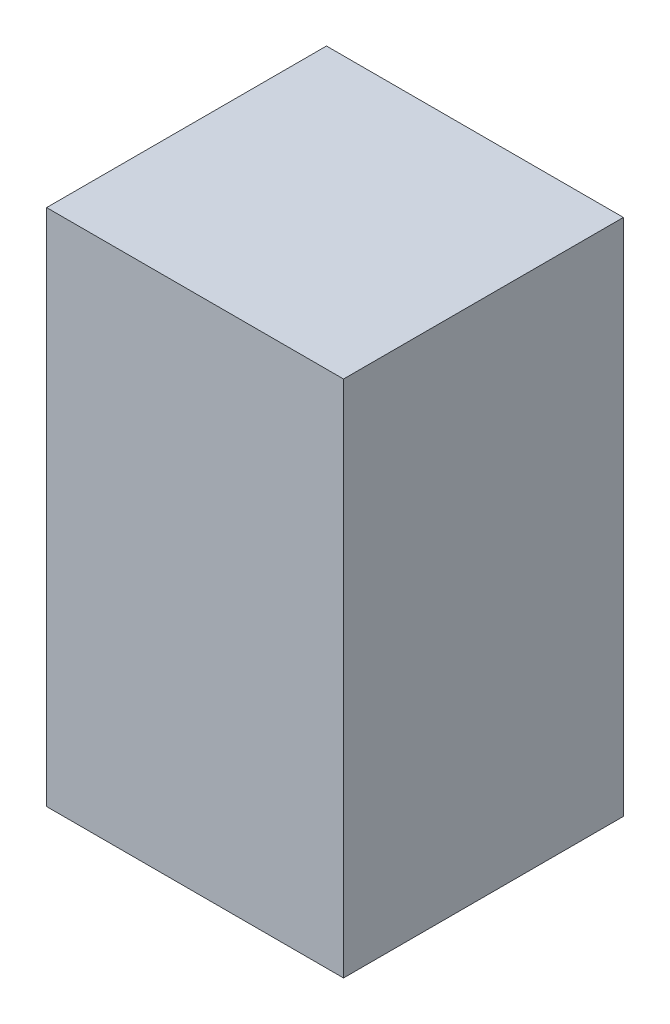
ISO-10303-21;
HEADER;
FILE_DESCRIPTION(('STEP AP214'),'2;1');
FILE_NAME('part.step','',(''),(''),'','','');
FILE_SCHEMA(('AUTOMOTIVE_DESIGN { 1 0 10303 214 1 1 1 1 }'));
ENDSEC;
DATA;
#1=APPLICATION_CONTEXT('core data for automotive mechanical design processes');
#2=APPLICATION_PROTOCOL_DEFINITION('international standard','automotive_design',2000,#1);
#3=PRODUCT_CONTEXT('',#1,'mechanical');
#4=PRODUCT('Part','Part','',(#3));
#5=PRODUCT_RELATED_PRODUCT_CATEGORY('part','',(#4));
#6=PRODUCT_DEFINITION_FORMATION('','',#4);
#7=PRODUCT_DEFINITION_CONTEXT('part definition',#1,'design');
#8=PRODUCT_DEFINITION('design','',#6,#7);
#9=PRODUCT_DEFINITION_SHAPE('','',#8);
#10=(LENGTH_UNIT() NAMED_UNIT(*) SI_UNIT(.MILLI.,.METRE.));
#11=(NAMED_UNIT(*) PLANE_ANGLE_UNIT() SI_UNIT($,.RADIAN.));
#12=(NAMED_UNIT(*) SI_UNIT($,.STERADIAN.) SOLID_ANGLE_UNIT());
#13=UNCERTAINTY_MEASURE_WITH_UNIT(LENGTH_MEASURE(1.E-05),#10,'distance_accuracy_value','');
#14=(GEOMETRIC_REPRESENTATION_CONTEXT(3) GLOBAL_UNCERTAINTY_ASSIGNED_CONTEXT((#13)) GLOBAL_UNIT_ASSIGNED_CONTEXT((#10,
#11,#12)) REPRESENTATION_CONTEXT('',''));
#15=CARTESIAN_POINT('',(0.,0.,0.));
#16=DIRECTION('',(0.,0.,1.));
#17=DIRECTION('',(1.,0.,0.));
#18=AXIS2_PLACEMENT_3D('',#15,#16,#17);
#19=CARTESIAN_POINT('',(-43.5,76.,90.));
#20=DIRECTION('',(1.,0.,0.));
#21=DIRECTION('',(0.,0.,-1.));
#22=AXIS2_PLACEMENT_3D('',#19,#20,#21);
#23=PLANE('',#22);
#24=DIRECTION('',(0.,-1.,0.));
#25=VECTOR('',#24,1.);
#26=CARTESIAN_POINT('',(-43.5,76.,8.));
#27=LINE('',#26,#25);
#28=CARTESIAN_POINT('',(-43.5,76.,8.));
#29=VERTEX_POINT('',#28);
#30=CARTESIAN_POINT('',(-43.5,-76.,8.));
#31=VERTEX_POINT('',#30);
#32=EDGE_CURVE('E105',#29,#31,#27,.T.);
#33=ORIENTED_EDGE('',*,*,#32,.T.);
#34=DIRECTION('',(0.,0.,-1.));
#35=VECTOR('',#34,1.);
#36=CARTESIAN_POINT('',(-43.5,-76.,90.));
#37=LINE('',#36,#35);
#38=CARTESIAN_POINT('',(-43.5,-76.,90.));
#39=VERTEX_POINT('',#38);
#40=EDGE_CURVE('E11',#39,#31,#37,.T.);
#41=ORIENTED_EDGE('',*,*,#40,.F.);
#42=DIRECTION('',(0.,-1.,0.));
#43=VECTOR('',#42,1.);
#44=CARTESIAN_POINT('',(-43.5,76.,90.));
#45=LINE('',#44,#43);
#46=CARTESIAN_POINT('',(-43.5,76.,90.));
#47=VERTEX_POINT('',#46);
#48=EDGE_CURVE('E89',#47,#39,#45,.T.);
#49=ORIENTED_EDGE('',*,*,#48,.F.);
#50=DIRECTION('',(0.,0.,-1.));
#51=VECTOR('',#50,1.);
#52=CARTESIAN_POINT('',(-43.5,76.,90.));
#53=LINE('',#52,#51);
#54=EDGE_CURVE('E97',#47,#29,#53,.T.);
#55=ORIENTED_EDGE('',*,*,#54,.T.);
#56=EDGE_LOOP('',(#33,#41,#49,#55));
#57=FACE_BOUND('',#56,.T.);
#58=ADVANCED_FACE('F39',(#57),#23,.F.);
#59=CARTESIAN_POINT('',(-43.5,-76.,90.));
#60=DIRECTION('',(0.,1.,0.));
#61=DIRECTION('',(0.,0.,1.));
#62=AXIS2_PLACEMENT_3D('',#59,#60,#61);
#63=PLANE('',#62);
#64=DIRECTION('',(1.,0.,0.));
#65=VECTOR('',#64,1.);
#66=CARTESIAN_POINT('',(-43.5,-76.,8.));
#67=LINE('',#66,#65);
#68=CARTESIAN_POINT('',(43.5,-76.,8.));
#69=VERTEX_POINT('',#68);
#70=EDGE_CURVE('E92',#31,#69,#67,.T.);
#71=ORIENTED_EDGE('',*,*,#70,.T.);
#72=DIRECTION('',(0.,0.,-1.));
#73=VECTOR('',#72,1.);
#74=CARTESIAN_POINT('',(43.5,-76.,90.));
#75=LINE('',#74,#73);
#76=CARTESIAN_POINT('',(43.5,-76.,90.));
#77=VERTEX_POINT('',#76);
#78=EDGE_CURVE('E50',#77,#69,#75,.T.);
#79=ORIENTED_EDGE('',*,*,#78,.F.);
#80=DIRECTION('',(1.,0.,0.));
#81=VECTOR('',#80,1.);
#82=CARTESIAN_POINT('',(-43.5,-76.,90.));
#83=LINE('',#82,#81);
#84=EDGE_CURVE('E82',#39,#77,#83,.T.);
#85=ORIENTED_EDGE('',*,*,#84,.F.);
#86=ORIENTED_EDGE('',*,*,#40,.T.);
#87=EDGE_LOOP('',(#71,#79,#85,#86));
#88=FACE_BOUND('',#87,.T.);
#89=ADVANCED_FACE('F93',(#88),#63,.F.);
#90=CARTESIAN_POINT('',(43.5,-76.,90.));
#91=DIRECTION('',(-1.,0.,0.));
#92=DIRECTION('',(0.,0.,1.));
#93=AXIS2_PLACEMENT_3D('',#90,#91,#92);
#94=PLANE('',#93);
#95=DIRECTION('',(0.,1.,0.));
#96=VECTOR('',#95,1.);
#97=CARTESIAN_POINT('',(43.5,-76.,8.));
#98=LINE('',#97,#96);
#99=CARTESIAN_POINT('',(43.5,76.,8.));
#100=VERTEX_POINT('',#99);
#101=EDGE_CURVE('E74',#69,#100,#98,.T.);
#102=ORIENTED_EDGE('',*,*,#101,.T.);
#103=DIRECTION('',(0.,0.,-1.));
#104=VECTOR('',#103,1.);
#105=CARTESIAN_POINT('',(43.5,76.,90.));
#106=LINE('',#105,#104);
#107=CARTESIAN_POINT('',(43.5,76.,90.));
#108=VERTEX_POINT('',#107);
#109=EDGE_CURVE('E94',#108,#100,#106,.T.);
#110=ORIENTED_EDGE('',*,*,#109,.F.);
#111=DIRECTION('',(0.,1.,0.));
#112=VECTOR('',#111,1.);
#113=CARTESIAN_POINT('',(43.5,-76.,90.));
#114=LINE('',#113,#112);
#115=EDGE_CURVE('E88',#77,#108,#114,.T.);
#116=ORIENTED_EDGE('',*,*,#115,.F.);
#117=ORIENTED_EDGE('',*,*,#78,.T.);
#118=EDGE_LOOP('',(#102,#110,#116,#117));
#119=FACE_BOUND('',#118,.T.);
#120=ADVANCED_FACE('F96',(#119),#94,.F.);
#121=CARTESIAN_POINT('',(43.5,76.,90.));
#122=DIRECTION('',(0.,-1.,0.));
#123=DIRECTION('',(0.,0.,-1.));
#124=AXIS2_PLACEMENT_3D('',#121,#122,#123);
#125=PLANE('',#124);
#126=DIRECTION('',(-1.,0.,0.));
#127=VECTOR('',#126,1.);
#128=CARTESIAN_POINT('',(43.5,76.,8.));
#129=LINE('',#128,#127);
#130=EDGE_CURVE('E76',#100,#29,#129,.T.);
#131=ORIENTED_EDGE('',*,*,#130,.T.);
#132=ORIENTED_EDGE('',*,*,#54,.F.);
#133=DIRECTION('',(-1.,0.,0.));
#134=VECTOR('',#133,1.);
#135=CARTESIAN_POINT('',(43.5,76.,90.));
#136=LINE('',#135,#134);
#137=EDGE_CURVE('E54',#108,#47,#136,.T.);
#138=ORIENTED_EDGE('',*,*,#137,.F.);
#139=ORIENTED_EDGE('',*,*,#109,.T.);
#140=EDGE_LOOP('',(#131,#132,#138,#139));
#141=FACE_BOUND('',#140,.T.);
#142=ADVANCED_FACE('F106',(#141),#125,.F.);
#143=CARTESIAN_POINT('',(0.,0.,90.));
#144=DIRECTION('',(0.,0.,1.));
#145=DIRECTION('',(1.,0.,0.));
#146=AXIS2_PLACEMENT_3D('',#143,#144,#145);
#147=PLANE('',#146);
#148=ORIENTED_EDGE('',*,*,#48,.T.);
#149=ORIENTED_EDGE('',*,*,#84,.T.);
#150=ORIENTED_EDGE('',*,*,#115,.T.);
#151=ORIENTED_EDGE('',*,*,#137,.T.);
#152=EDGE_LOOP('',(#148,#149,#150,#151));
#153=FACE_BOUND('',#152,.T.);
#154=ADVANCED_FACE('F86',(#153),#147,.T.);
#155=CARTESIAN_POINT('',(0.,0.,8.));
#156=DIRECTION('',(0.,0.,1.));
#157=DIRECTION('',(1.,0.,0.));
#158=AXIS2_PLACEMENT_3D('',#155,#156,#157);
#159=PLANE('',#158);
#160=ORIENTED_EDGE('',*,*,#32,.F.);
#161=ORIENTED_EDGE('',*,*,#130,.F.);
#162=ORIENTED_EDGE('',*,*,#101,.F.);
#163=ORIENTED_EDGE('',*,*,#70,.F.);
#164=EDGE_LOOP('',(#160,#161,#162,#163));
#165=FACE_BOUND('',#164,.T.);
#166=ADVANCED_FACE('F115',(#165),#159,.F.);
#167=CLOSED_SHELL('',(#58,#89,#120,#142,#154,#166));
#168=MANIFOLD_SOLID_BREP('B2',#167);
#169=ADVANCED_BREP_SHAPE_REPRESENTATION('',(#18,#168),#14);
#170=SHAPE_DEFINITION_REPRESENTATION(#9,#169);
ENDSEC;
END-ISO-10303-21;
